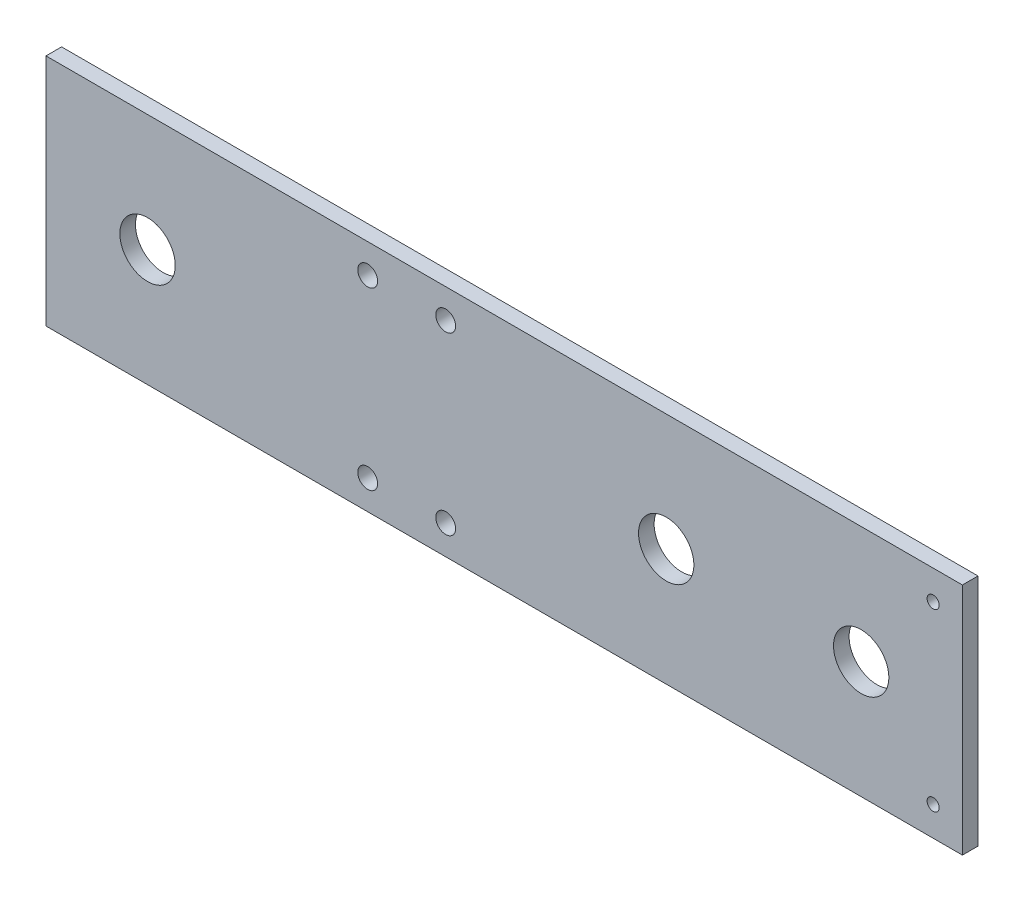
ISO-10303-21;
HEADER;
FILE_DESCRIPTION(('STEP AP214'),'2;1');
FILE_NAME('part.step','',(''),(''),'','','');
FILE_SCHEMA(('AUTOMOTIVE_DESIGN { 1 0 10303 214 1 1 1 1 }'));
ENDSEC;
DATA;
#1=APPLICATION_CONTEXT('core data for automotive mechanical design processes');
#2=APPLICATION_PROTOCOL_DEFINITION('international standard','automotive_design',2000,#1);
#3=PRODUCT_CONTEXT('',#1,'mechanical');
#4=PRODUCT('Part','Part','',(#3));
#5=PRODUCT_RELATED_PRODUCT_CATEGORY('part','',(#4));
#6=PRODUCT_DEFINITION_FORMATION('','',#4);
#7=PRODUCT_DEFINITION_CONTEXT('part definition',#1,'design');
#8=PRODUCT_DEFINITION('design','',#6,#7);
#9=PRODUCT_DEFINITION_SHAPE('','',#8);
#10=(LENGTH_UNIT() NAMED_UNIT(*) SI_UNIT(.MILLI.,.METRE.));
#11=(NAMED_UNIT(*) PLANE_ANGLE_UNIT() SI_UNIT($,.RADIAN.));
#12=(NAMED_UNIT(*) SI_UNIT($,.STERADIAN.) SOLID_ANGLE_UNIT());
#13=UNCERTAINTY_MEASURE_WITH_UNIT(LENGTH_MEASURE(1.E-05),#10,'distance_accuracy_value','');
#14=(GEOMETRIC_REPRESENTATION_CONTEXT(3) GLOBAL_UNCERTAINTY_ASSIGNED_CONTEXT((#13)) GLOBAL_UNIT_ASSIGNED_CONTEXT((#10,
#11,#12)) REPRESENTATION_CONTEXT('',''));
#15=CARTESIAN_POINT('',(0.,0.,0.));
#16=DIRECTION('',(0.,0.,1.));
#17=DIRECTION('',(1.,0.,0.));
#18=AXIS2_PLACEMENT_3D('',#15,#16,#17);
#19=CARTESIAN_POINT('',(0.,0.,4.));
#20=DIRECTION('',(0.,0.,1.));
#21=DIRECTION('',(1.,0.,0.));
#22=AXIS2_PLACEMENT_3D('',#19,#20,#21);
#23=PLANE('',#22);
#24=CARTESIAN_POINT('',(-76.5486221174277,-22.4926529763068,4.));
#25=DIRECTION('',(0.,0.,1.));
#26=DIRECTION('',(1.,0.,0.));
#27=AXIS2_PLACEMENT_3D('',#24,#25,#26);
#28=CIRCLE('',#27,2.54999999999964);
#29=CARTESIAN_POINT('',(-73.9986221174281,-22.4926529763068,4.));
#30=VERTEX_POINT('',#29);
#31=EDGE_CURVE('E150',#30,#30,#28,.T.);
#32=ORIENTED_EDGE('',*,*,#31,.F.);
#33=EDGE_LOOP('',(#32));
#34=FACE_BOUND('',#33,.T.);
#35=CARTESIAN_POINT('',(-56.5486221174277,-22.4926529763066,4.));
#36=DIRECTION('',(0.,0.,1.));
#37=DIRECTION('',(1.,0.,0.));
#38=AXIS2_PLACEMENT_3D('',#35,#36,#37);
#39=CIRCLE('',#38,2.5499999999996);
#40=CARTESIAN_POINT('',(-53.9986221174281,-22.4926529763066,4.));
#41=VERTEX_POINT('',#40);
#42=EDGE_CURVE('E138',#41,#41,#39,.T.);
#43=ORIENTED_EDGE('',*,*,#42,.F.);
#44=EDGE_LOOP('',(#43));
#45=FACE_BOUND('',#44,.T.);
#46=CARTESIAN_POINT('',(68.4513778825723,-22.4926529763066,4.));
#47=DIRECTION('',(0.,0.,1.));
#48=DIRECTION('',(1.,0.,0.));
#49=AXIS2_PLACEMENT_3D('',#46,#47,#48);
#50=CIRCLE('',#49,1.54999999999964);
#51=CARTESIAN_POINT('',(70.0013778825719,-22.4926529763066,4.));
#52=VERTEX_POINT('',#51);
#53=EDGE_CURVE('E126',#52,#52,#50,.T.);
#54=ORIENTED_EDGE('',*,*,#53,.F.);
#55=EDGE_LOOP('',(#54));
#56=FACE_BOUND('',#55,.T.);
#57=CARTESIAN_POINT('',(50.0000000000005,-5.86369959320203E-13,4.));
#58=DIRECTION('',(0.,0.,1.));
#59=DIRECTION('',(1.,0.,0.));
#60=AXIS2_PLACEMENT_3D('',#57,#58,#59);
#61=CIRCLE('',#60,7.09999999999959);
#62=CARTESIAN_POINT('',(57.1000000000001,-5.86369959320203E-13,4.));
#63=VERTEX_POINT('',#62);
#64=EDGE_CURVE('E114',#63,#63,#61,.T.);
#65=ORIENTED_EDGE('',*,*,#64,.F.);
#66=EDGE_LOOP('',(#65));
#67=FACE_BOUND('',#66,.T.);
#68=DIRECTION('',(0.,1.,0.));
#69=VECTOR('',#68,1.);
#70=CARTESIAN_POINT('',(75.9587249062652,-30.0000000000001,4.));
#71=LINE('',#70,#69);
#72=CARTESIAN_POINT('',(75.9587249062652,-30.0000000000001,4.));
#73=VERTEX_POINT('',#72);
#74=CARTESIAN_POINT('',(75.9587249062652,29.9999999999999,4.));
#75=VERTEX_POINT('',#74);
#76=EDGE_CURVE('E84',#73,#75,#71,.T.);
#77=ORIENTED_EDGE('',*,*,#76,.T.);
#78=DIRECTION('',(-1.,0.,0.));
#79=VECTOR('',#78,1.);
#80=CARTESIAN_POINT('',(75.9587249062652,29.9999999999999,4.));
#81=LINE('',#80,#79);
#82=CARTESIAN_POINT('',(-159.041275093735,29.9999999999999,4.));
#83=VERTEX_POINT('',#82);
#84=EDGE_CURVE('E79',#75,#83,#81,.T.);
#85=ORIENTED_EDGE('',*,*,#84,.T.);
#86=DIRECTION('',(0.,-1.,0.));
#87=VECTOR('',#86,1.);
#88=CARTESIAN_POINT('',(-159.041275093735,-30.0000000000001,4.));
#89=LINE('',#88,#87);
#90=CARTESIAN_POINT('',(-159.041275093735,-30.0000000000001,4.));
#91=VERTEX_POINT('',#90);
#92=EDGE_CURVE('E82',#83,#91,#89,.T.);
#93=ORIENTED_EDGE('',*,*,#92,.T.);
#94=DIRECTION('',(1.,0.,0.));
#95=VECTOR('',#94,1.);
#96=CARTESIAN_POINT('',(75.9587249062652,-30.0000000000001,4.));
#97=LINE('',#96,#95);
#98=EDGE_CURVE('E49',#91,#73,#97,.T.);
#99=ORIENTED_EDGE('',*,*,#98,.T.);
#100=EDGE_LOOP('',(#77,#85,#93,#99));
#101=FACE_BOUND('',#100,.T.);
#102=CARTESIAN_POINT('',(-132.999999999999,-5.52652843906882E-13,4.));
#103=DIRECTION('',(0.,0.,1.));
#104=DIRECTION('',(1.,0.,0.));
#105=AXIS2_PLACEMENT_3D('',#102,#103,#104);
#106=CIRCLE('',#105,7.0999999999996);
#107=CARTESIAN_POINT('',(-125.9,-5.52652843906882E-13,4.));
#108=VERTEX_POINT('',#107);
#109=EDGE_CURVE('E99',#108,#108,#106,.T.);
#110=ORIENTED_EDGE('',*,*,#109,.F.);
#111=EDGE_LOOP('',(#110));
#112=FACE_BOUND('',#111,.T.);
#113=CARTESIAN_POINT('',(6.03683769639929E-13,-5.16318678765429E-13,4.));
#114=DIRECTION('',(0.,0.,1.));
#115=DIRECTION('',(1.,0.,0.));
#116=AXIS2_PLACEMENT_3D('',#113,#114,#115);
#117=CIRCLE('',#116,7.09999999999958);
#118=CARTESIAN_POINT('',(7.10000000000019,-5.16318678765429E-13,4.));
#119=VERTEX_POINT('',#118);
#120=EDGE_CURVE('E120',#119,#119,#117,.T.);
#121=ORIENTED_EDGE('',*,*,#120,.F.);
#122=EDGE_LOOP('',(#121));
#123=FACE_BOUND('',#122,.T.);
#124=CARTESIAN_POINT('',(68.4513778825722,22.4926529763062,4.));
#125=DIRECTION('',(0.,0.,1.));
#126=DIRECTION('',(1.,0.,0.));
#127=AXIS2_PLACEMENT_3D('',#124,#125,#126);
#128=CIRCLE('',#127,1.54999999999964);
#129=CARTESIAN_POINT('',(70.0013778825719,22.4926529763062,4.));
#130=VERTEX_POINT('',#129);
#131=EDGE_CURVE('E132',#130,#130,#128,.T.);
#132=ORIENTED_EDGE('',*,*,#131,.F.);
#133=EDGE_LOOP('',(#132));
#134=FACE_BOUND('',#133,.T.);
#135=CARTESIAN_POINT('',(-56.5486221174277,22.4926529763062,4.));
#136=DIRECTION('',(0.,0.,1.));
#137=DIRECTION('',(1.,0.,0.));
#138=AXIS2_PLACEMENT_3D('',#135,#136,#137);
#139=CIRCLE('',#138,2.54999999999959);
#140=CARTESIAN_POINT('',(-53.9986221174281,22.4926529763062,4.));
#141=VERTEX_POINT('',#140);
#142=EDGE_CURVE('E144',#141,#141,#139,.T.);
#143=ORIENTED_EDGE('',*,*,#142,.F.);
#144=EDGE_LOOP('',(#143));
#145=FACE_BOUND('',#144,.T.);
#146=CARTESIAN_POINT('',(-76.5486221174277,22.4926529763061,4.));
#147=DIRECTION('',(0.,0.,1.));
#148=DIRECTION('',(1.,0.,0.));
#149=AXIS2_PLACEMENT_3D('',#146,#147,#148);
#150=CIRCLE('',#149,2.54999999999961);
#151=CARTESIAN_POINT('',(-73.9986221174281,22.4926529763061,4.));
#152=VERTEX_POINT('',#151);
#153=EDGE_CURVE('E156',#152,#152,#150,.T.);
#154=ORIENTED_EDGE('',*,*,#153,.F.);
#155=EDGE_LOOP('',(#154));
#156=FACE_BOUND('',#155,.T.);
#157=ADVANCED_FACE('F32',(#34,#45,#56,#67,#101,#112,#123,#134,#145,#156),#23,.T.);
#158=CARTESIAN_POINT('',(0.,0.,0.));
#159=DIRECTION('',(0.,0.,1.));
#160=DIRECTION('',(1.,0.,0.));
#161=AXIS2_PLACEMENT_3D('',#158,#159,#160);
#162=PLANE('',#161);
#163=DIRECTION('',(0.,1.,0.));
#164=VECTOR('',#163,1.);
#165=CARTESIAN_POINT('',(75.9587249062652,-30.0000000000001,0.));
#166=LINE('',#165,#164);
#167=CARTESIAN_POINT('',(75.9587249062652,-30.0000000000001,0.));
#168=VERTEX_POINT('',#167);
#169=CARTESIAN_POINT('',(75.9587249062652,29.9999999999999,0.));
#170=VERTEX_POINT('',#169);
#171=EDGE_CURVE('E96',#168,#170,#166,.T.);
#172=ORIENTED_EDGE('',*,*,#171,.F.);
#173=DIRECTION('',(1.,0.,0.));
#174=VECTOR('',#173,1.);
#175=CARTESIAN_POINT('',(75.9587249062652,-30.0000000000001,0.));
#176=LINE('',#175,#174);
#177=CARTESIAN_POINT('',(-159.041275093735,-30.0000000000001,0.));
#178=VERTEX_POINT('',#177);
#179=EDGE_CURVE('E72',#178,#168,#176,.T.);
#180=ORIENTED_EDGE('',*,*,#179,.F.);
#181=DIRECTION('',(0.,-1.,0.));
#182=VECTOR('',#181,1.);
#183=CARTESIAN_POINT('',(-159.041275093735,-30.0000000000001,0.));
#184=LINE('',#183,#182);
#185=CARTESIAN_POINT('',(-159.041275093735,29.9999999999999,0.));
#186=VERTEX_POINT('',#185);
#187=EDGE_CURVE('E66',#186,#178,#184,.T.);
#188=ORIENTED_EDGE('',*,*,#187,.F.);
#189=DIRECTION('',(-1.,0.,0.));
#190=VECTOR('',#189,1.);
#191=CARTESIAN_POINT('',(75.9587249062652,29.9999999999999,0.));
#192=LINE('',#191,#190);
#193=EDGE_CURVE('E88',#170,#186,#192,.T.);
#194=ORIENTED_EDGE('',*,*,#193,.F.);
#195=EDGE_LOOP('',(#172,#180,#188,#194));
#196=FACE_BOUND('',#195,.T.);
#197=CARTESIAN_POINT('',(-132.999999999999,-5.52652843906882E-13,0.));
#198=DIRECTION('',(0.,0.,1.));
#199=DIRECTION('',(1.,0.,0.));
#200=AXIS2_PLACEMENT_3D('',#197,#198,#199);
#201=CIRCLE('',#200,7.0999999999996);
#202=CARTESIAN_POINT('',(-125.9,-5.52652843906882E-13,0.));
#203=VERTEX_POINT('',#202);
#204=EDGE_CURVE('E111',#203,#203,#201,.T.);
#205=ORIENTED_EDGE('',*,*,#204,.T.);
#206=EDGE_LOOP('',(#205));
#207=FACE_BOUND('',#206,.T.);
#208=CARTESIAN_POINT('',(50.0000000000005,-5.86369959320203E-13,0.));
#209=DIRECTION('',(0.,0.,1.));
#210=DIRECTION('',(1.,0.,0.));
#211=AXIS2_PLACEMENT_3D('',#208,#209,#210);
#212=CIRCLE('',#211,7.09999999999959);
#213=CARTESIAN_POINT('',(57.1000000000001,-5.86369959320203E-13,0.));
#214=VERTEX_POINT('',#213);
#215=EDGE_CURVE('E117',#214,#214,#212,.T.);
#216=ORIENTED_EDGE('',*,*,#215,.T.);
#217=EDGE_LOOP('',(#216));
#218=FACE_BOUND('',#217,.T.);
#219=CARTESIAN_POINT('',(6.03683769639929E-13,-5.16318678765429E-13,0.));
#220=DIRECTION('',(0.,0.,1.));
#221=DIRECTION('',(1.,0.,0.));
#222=AXIS2_PLACEMENT_3D('',#219,#220,#221);
#223=CIRCLE('',#222,7.09999999999958);
#224=CARTESIAN_POINT('',(7.10000000000019,-5.16318678765429E-13,0.));
#225=VERTEX_POINT('',#224);
#226=EDGE_CURVE('E123',#225,#225,#223,.T.);
#227=ORIENTED_EDGE('',*,*,#226,.T.);
#228=EDGE_LOOP('',(#227));
#229=FACE_BOUND('',#228,.T.);
#230=CARTESIAN_POINT('',(68.4513778825723,-22.4926529763066,0.));
#231=DIRECTION('',(0.,0.,1.));
#232=DIRECTION('',(1.,0.,0.));
#233=AXIS2_PLACEMENT_3D('',#230,#231,#232);
#234=CIRCLE('',#233,1.54999999999964);
#235=CARTESIAN_POINT('',(70.0013778825719,-22.4926529763066,0.));
#236=VERTEX_POINT('',#235);
#237=EDGE_CURVE('E129',#236,#236,#234,.T.);
#238=ORIENTED_EDGE('',*,*,#237,.T.);
#239=EDGE_LOOP('',(#238));
#240=FACE_BOUND('',#239,.T.);
#241=CARTESIAN_POINT('',(68.4513778825722,22.4926529763062,0.));
#242=DIRECTION('',(0.,0.,1.));
#243=DIRECTION('',(1.,0.,0.));
#244=AXIS2_PLACEMENT_3D('',#241,#242,#243);
#245=CIRCLE('',#244,1.54999999999964);
#246=CARTESIAN_POINT('',(70.0013778825719,22.4926529763062,0.));
#247=VERTEX_POINT('',#246);
#248=EDGE_CURVE('E135',#247,#247,#245,.T.);
#249=ORIENTED_EDGE('',*,*,#248,.T.);
#250=EDGE_LOOP('',(#249));
#251=FACE_BOUND('',#250,.T.);
#252=CARTESIAN_POINT('',(-56.5486221174277,-22.4926529763066,0.));
#253=DIRECTION('',(0.,0.,1.));
#254=DIRECTION('',(1.,0.,0.));
#255=AXIS2_PLACEMENT_3D('',#252,#253,#254);
#256=CIRCLE('',#255,2.5499999999996);
#257=CARTESIAN_POINT('',(-53.9986221174281,-22.4926529763066,0.));
#258=VERTEX_POINT('',#257);
#259=EDGE_CURVE('E141',#258,#258,#256,.T.);
#260=ORIENTED_EDGE('',*,*,#259,.T.);
#261=EDGE_LOOP('',(#260));
#262=FACE_BOUND('',#261,.T.);
#263=CARTESIAN_POINT('',(-56.5486221174277,22.4926529763062,0.));
#264=DIRECTION('',(0.,0.,1.));
#265=DIRECTION('',(1.,0.,0.));
#266=AXIS2_PLACEMENT_3D('',#263,#264,#265);
#267=CIRCLE('',#266,2.54999999999959);
#268=CARTESIAN_POINT('',(-53.9986221174281,22.4926529763062,0.));
#269=VERTEX_POINT('',#268);
#270=EDGE_CURVE('E147',#269,#269,#267,.T.);
#271=ORIENTED_EDGE('',*,*,#270,.T.);
#272=EDGE_LOOP('',(#271));
#273=FACE_BOUND('',#272,.T.);
#274=CARTESIAN_POINT('',(-76.5486221174277,-22.4926529763068,0.));
#275=DIRECTION('',(0.,0.,1.));
#276=DIRECTION('',(1.,0.,0.));
#277=AXIS2_PLACEMENT_3D('',#274,#275,#276);
#278=CIRCLE('',#277,2.54999999999964);
#279=CARTESIAN_POINT('',(-73.9986221174281,-22.4926529763068,0.));
#280=VERTEX_POINT('',#279);
#281=EDGE_CURVE('E153',#280,#280,#278,.T.);
#282=ORIENTED_EDGE('',*,*,#281,.T.);
#283=EDGE_LOOP('',(#282));
#284=FACE_BOUND('',#283,.T.);
#285=CARTESIAN_POINT('',(-76.5486221174277,22.4926529763061,0.));
#286=DIRECTION('',(0.,0.,1.));
#287=DIRECTION('',(1.,0.,0.));
#288=AXIS2_PLACEMENT_3D('',#285,#286,#287);
#289=CIRCLE('',#288,2.54999999999961);
#290=CARTESIAN_POINT('',(-73.9986221174281,22.4926529763061,0.));
#291=VERTEX_POINT('',#290);
#292=EDGE_CURVE('E159',#291,#291,#289,.T.);
#293=ORIENTED_EDGE('',*,*,#292,.T.);
#294=EDGE_LOOP('',(#293));
#295=FACE_BOUND('',#294,.T.);
#296=ADVANCED_FACE('F107',(#196,#207,#218,#229,#240,#251,#262,#273,#284,#295),#162,.F.);
#297=CARTESIAN_POINT('',(75.9587249062652,-30.0000000000001,4.));
#298=DIRECTION('',(-1.,0.,0.));
#299=DIRECTION('',(0.,0.,1.));
#300=AXIS2_PLACEMENT_3D('',#297,#298,#299);
#301=PLANE('',#300);
#302=ORIENTED_EDGE('',*,*,#171,.T.);
#303=DIRECTION('',(0.,0.,-1.));
#304=VECTOR('',#303,1.);
#305=CARTESIAN_POINT('',(75.9587249062652,29.9999999999999,4.));
#306=LINE('',#305,#304);
#307=EDGE_CURVE('E11',#75,#170,#306,.T.);
#308=ORIENTED_EDGE('',*,*,#307,.F.);
#309=ORIENTED_EDGE('',*,*,#76,.F.);
#310=DIRECTION('',(0.,0.,-1.));
#311=VECTOR('',#310,1.);
#312=CARTESIAN_POINT('',(75.9587249062652,-30.0000000000001,4.));
#313=LINE('',#312,#311);
#314=EDGE_CURVE('E92',#73,#168,#313,.T.);
#315=ORIENTED_EDGE('',*,*,#314,.T.);
#316=EDGE_LOOP('',(#302,#308,#309,#315));
#317=FACE_BOUND('',#316,.T.);
#318=ADVANCED_FACE('F34',(#317),#301,.F.);
#319=CARTESIAN_POINT('',(75.9587249062652,29.9999999999999,4.));
#320=DIRECTION('',(0.,-1.,0.));
#321=DIRECTION('',(1.,0.,0.));
#322=AXIS2_PLACEMENT_3D('',#319,#320,#321);
#323=PLANE('',#322);
#324=ORIENTED_EDGE('',*,*,#193,.T.);
#325=DIRECTION('',(0.,0.,-1.));
#326=VECTOR('',#325,1.);
#327=CARTESIAN_POINT('',(-159.041275093735,29.9999999999999,4.));
#328=LINE('',#327,#326);
#329=EDGE_CURVE('E41',#83,#186,#328,.T.);
#330=ORIENTED_EDGE('',*,*,#329,.F.);
#331=ORIENTED_EDGE('',*,*,#84,.F.);
#332=ORIENTED_EDGE('',*,*,#307,.T.);
#333=EDGE_LOOP('',(#324,#330,#331,#332));
#334=FACE_BOUND('',#333,.T.);
#335=ADVANCED_FACE('F87',(#334),#323,.F.);
#336=CARTESIAN_POINT('',(-159.041275093735,-30.0000000000001,4.));
#337=DIRECTION('',(1.,0.,0.));
#338=DIRECTION('',(0.,0.,-1.));
#339=AXIS2_PLACEMENT_3D('',#336,#337,#338);
#340=PLANE('',#339);
#341=ORIENTED_EDGE('',*,*,#187,.T.);
#342=DIRECTION('',(0.,0.,-1.));
#343=VECTOR('',#342,1.);
#344=CARTESIAN_POINT('',(-159.041275093735,-30.0000000000001,4.));
#345=LINE('',#344,#343);
#346=EDGE_CURVE('E89',#91,#178,#345,.T.);
#347=ORIENTED_EDGE('',*,*,#346,.F.);
#348=ORIENTED_EDGE('',*,*,#92,.F.);
#349=ORIENTED_EDGE('',*,*,#329,.T.);
#350=EDGE_LOOP('',(#341,#347,#348,#349));
#351=FACE_BOUND('',#350,.T.);
#352=ADVANCED_FACE('F90',(#351),#340,.F.);
#353=CARTESIAN_POINT('',(75.9587249062652,-30.0000000000001,4.));
#354=DIRECTION('',(0.,1.,0.));
#355=DIRECTION('',(-1.,0.,0.));
#356=AXIS2_PLACEMENT_3D('',#353,#354,#355);
#357=PLANE('',#356);
#358=ORIENTED_EDGE('',*,*,#179,.T.);
#359=ORIENTED_EDGE('',*,*,#314,.F.);
#360=ORIENTED_EDGE('',*,*,#98,.F.);
#361=ORIENTED_EDGE('',*,*,#346,.T.);
#362=EDGE_LOOP('',(#358,#359,#360,#361));
#363=FACE_BOUND('',#362,.T.);
#364=ADVANCED_FACE('F104',(#363),#357,.F.);
#365=CARTESIAN_POINT('',(-132.999999999999,-5.52652843906882E-13,4.));
#366=DIRECTION('',(0.,0.,-1.));
#367=DIRECTION('',(-1.,0.,0.));
#368=AXIS2_PLACEMENT_3D('',#365,#366,#367);
#369=CYLINDRICAL_SURFACE('',#368,7.0999999999996);
#370=ORIENTED_EDGE('',*,*,#109,.T.);
#371=EDGE_LOOP('',(#370));
#372=FACE_BOUND('',#371,.T.);
#373=ORIENTED_EDGE('',*,*,#204,.F.);
#374=EDGE_LOOP('',(#373));
#375=FACE_BOUND('',#374,.T.);
#376=ADVANCED_FACE('F178',(#372,#375),#369,.F.);
#377=CARTESIAN_POINT('',(50.0000000000005,-5.86369959320203E-13,4.));
#378=DIRECTION('',(0.,0.,-1.));
#379=DIRECTION('',(-1.,0.,0.));
#380=AXIS2_PLACEMENT_3D('',#377,#378,#379);
#381=CYLINDRICAL_SURFACE('',#380,7.09999999999959);
#382=ORIENTED_EDGE('',*,*,#64,.T.);
#383=EDGE_LOOP('',(#382));
#384=FACE_BOUND('',#383,.T.);
#385=ORIENTED_EDGE('',*,*,#215,.F.);
#386=EDGE_LOOP('',(#385));
#387=FACE_BOUND('',#386,.T.);
#388=ADVANCED_FACE('F224',(#384,#387),#381,.F.);
#389=CARTESIAN_POINT('',(6.03683769639929E-13,-5.16318678765429E-13,4.));
#390=DIRECTION('',(0.,0.,-1.));
#391=DIRECTION('',(-1.,0.,0.));
#392=AXIS2_PLACEMENT_3D('',#389,#390,#391);
#393=CYLINDRICAL_SURFACE('',#392,7.09999999999958);
#394=ORIENTED_EDGE('',*,*,#120,.T.);
#395=EDGE_LOOP('',(#394));
#396=FACE_BOUND('',#395,.T.);
#397=ORIENTED_EDGE('',*,*,#226,.F.);
#398=EDGE_LOOP('',(#397));
#399=FACE_BOUND('',#398,.T.);
#400=ADVANCED_FACE('F232',(#396,#399),#393,.F.);
#401=CARTESIAN_POINT('',(68.4513778825723,-22.4926529763066,4.));
#402=DIRECTION('',(0.,0.,-1.));
#403=DIRECTION('',(-1.,0.,0.));
#404=AXIS2_PLACEMENT_3D('',#401,#402,#403);
#405=CYLINDRICAL_SURFACE('',#404,1.54999999999964);
#406=ORIENTED_EDGE('',*,*,#53,.T.);
#407=EDGE_LOOP('',(#406));
#408=FACE_BOUND('',#407,.T.);
#409=ORIENTED_EDGE('',*,*,#237,.F.);
#410=EDGE_LOOP('',(#409));
#411=FACE_BOUND('',#410,.T.);
#412=ADVANCED_FACE('F240',(#408,#411),#405,.F.);
#413=CARTESIAN_POINT('',(68.4513778825722,22.4926529763062,4.));
#414=DIRECTION('',(0.,0.,-1.));
#415=DIRECTION('',(-1.,0.,0.));
#416=AXIS2_PLACEMENT_3D('',#413,#414,#415);
#417=CYLINDRICAL_SURFACE('',#416,1.54999999999964);
#418=ORIENTED_EDGE('',*,*,#131,.T.);
#419=EDGE_LOOP('',(#418));
#420=FACE_BOUND('',#419,.T.);
#421=ORIENTED_EDGE('',*,*,#248,.F.);
#422=EDGE_LOOP('',(#421));
#423=FACE_BOUND('',#422,.T.);
#424=ADVANCED_FACE('F249',(#420,#423),#417,.F.);
#425=CARTESIAN_POINT('',(-56.5486221174277,-22.4926529763066,4.));
#426=DIRECTION('',(0.,0.,-1.));
#427=DIRECTION('',(-1.,0.,0.));
#428=AXIS2_PLACEMENT_3D('',#425,#426,#427);
#429=CYLINDRICAL_SURFACE('',#428,2.5499999999996);
#430=ORIENTED_EDGE('',*,*,#42,.T.);
#431=EDGE_LOOP('',(#430));
#432=FACE_BOUND('',#431,.T.);
#433=ORIENTED_EDGE('',*,*,#259,.F.);
#434=EDGE_LOOP('',(#433));
#435=FACE_BOUND('',#434,.T.);
#436=ADVANCED_FACE('F258',(#432,#435),#429,.F.);
#437=CARTESIAN_POINT('',(-56.5486221174277,22.4926529763062,4.));
#438=DIRECTION('',(0.,0.,-1.));
#439=DIRECTION('',(-1.,0.,0.));
#440=AXIS2_PLACEMENT_3D('',#437,#438,#439);
#441=CYLINDRICAL_SURFACE('',#440,2.54999999999959);
#442=ORIENTED_EDGE('',*,*,#142,.T.);
#443=EDGE_LOOP('',(#442));
#444=FACE_BOUND('',#443,.T.);
#445=ORIENTED_EDGE('',*,*,#270,.F.);
#446=EDGE_LOOP('',(#445));
#447=FACE_BOUND('',#446,.T.);
#448=ADVANCED_FACE('F267',(#444,#447),#441,.F.);
#449=CARTESIAN_POINT('',(-76.5486221174277,-22.4926529763068,4.));
#450=DIRECTION('',(0.,0.,-1.));
#451=DIRECTION('',(-1.,0.,0.));
#452=AXIS2_PLACEMENT_3D('',#449,#450,#451);
#453=CYLINDRICAL_SURFACE('',#452,2.54999999999964);
#454=ORIENTED_EDGE('',*,*,#31,.T.);
#455=EDGE_LOOP('',(#454));
#456=FACE_BOUND('',#455,.T.);
#457=ORIENTED_EDGE('',*,*,#281,.F.);
#458=EDGE_LOOP('',(#457));
#459=FACE_BOUND('',#458,.T.);
#460=ADVANCED_FACE('F276',(#456,#459),#453,.F.);
#461=CARTESIAN_POINT('',(-76.5486221174277,22.4926529763061,4.));
#462=DIRECTION('',(0.,0.,-1.));
#463=DIRECTION('',(-1.,0.,0.));
#464=AXIS2_PLACEMENT_3D('',#461,#462,#463);
#465=CYLINDRICAL_SURFACE('',#464,2.54999999999961);
#466=ORIENTED_EDGE('',*,*,#153,.T.);
#467=EDGE_LOOP('',(#466));
#468=FACE_BOUND('',#467,.T.);
#469=ORIENTED_EDGE('',*,*,#292,.F.);
#470=EDGE_LOOP('',(#469));
#471=FACE_BOUND('',#470,.T.);
#472=ADVANCED_FACE('F165',(#468,#471),#465,.F.);
#473=CLOSED_SHELL('',(#157,#296,#318,#335,#352,#364,#376,#388,#400,#412,#424,#436,#448,#460,#472));
#474=MANIFOLD_SOLID_BREP('B2',#473);
#475=ADVANCED_BREP_SHAPE_REPRESENTATION('',(#18,#474),#14);
#476=SHAPE_DEFINITION_REPRESENTATION(#9,#475);
ENDSEC;
END-ISO-10303-21;
